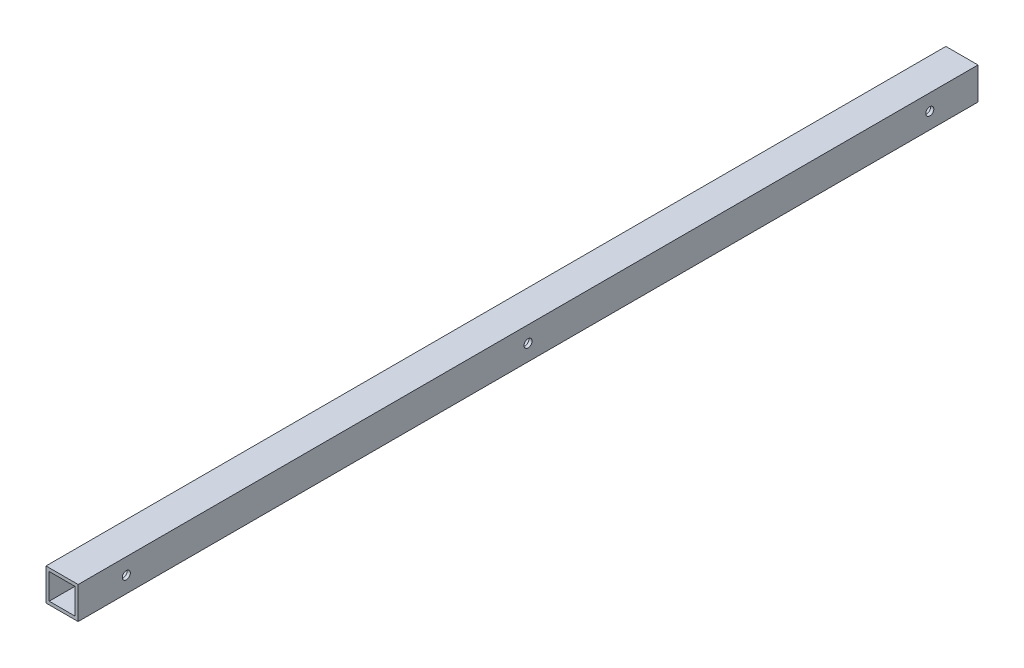
ISO-10303-21;
HEADER;
FILE_DESCRIPTION(('STEP AP214'),'2;1');
FILE_NAME('part.step','',(''),(''),'','','');
FILE_SCHEMA(('AUTOMOTIVE_DESIGN { 1 0 10303 214 1 1 1 1 }'));
ENDSEC;
DATA;
#1=APPLICATION_CONTEXT('core data for automotive mechanical design processes');
#2=APPLICATION_PROTOCOL_DEFINITION('international standard','automotive_design',2000,#1);
#3=PRODUCT_CONTEXT('',#1,'mechanical');
#4=PRODUCT('Part','Part','',(#3));
#5=PRODUCT_RELATED_PRODUCT_CATEGORY('part','',(#4));
#6=PRODUCT_DEFINITION_FORMATION('','',#4);
#7=PRODUCT_DEFINITION_CONTEXT('part definition',#1,'design');
#8=PRODUCT_DEFINITION('design','',#6,#7);
#9=PRODUCT_DEFINITION_SHAPE('','',#8);
#10=(LENGTH_UNIT() NAMED_UNIT(*) SI_UNIT(.MILLI.,.METRE.));
#11=(NAMED_UNIT(*) PLANE_ANGLE_UNIT() SI_UNIT($,.RADIAN.));
#12=(NAMED_UNIT(*) SI_UNIT($,.STERADIAN.) SOLID_ANGLE_UNIT());
#13=UNCERTAINTY_MEASURE_WITH_UNIT(LENGTH_MEASURE(1.E-05),#10,'distance_accuracy_value','');
#14=(GEOMETRIC_REPRESENTATION_CONTEXT(3) GLOBAL_UNCERTAINTY_ASSIGNED_CONTEXT((#13)) GLOBAL_UNIT_ASSIGNED_CONTEXT((#10,
#11,#12)) REPRESENTATION_CONTEXT('',''));
#15=CARTESIAN_POINT('',(0.,0.,0.));
#16=DIRECTION('',(0.,0.,1.));
#17=DIRECTION('',(1.,0.,0.));
#18=AXIS2_PLACEMENT_3D('',#15,#16,#17);
#19=CARTESIAN_POINT('',(10.,10.,-560.));
#20=DIRECTION('',(1.,0.,0.));
#21=DIRECTION('',(0.,0.,-1.));
#22=AXIS2_PLACEMENT_3D('',#19,#20,#21);
#23=PLANE('',#22);
#24=CARTESIAN_POINT('',(10.,0.,-530.));
#25=DIRECTION('',(1.,0.,0.));
#26=DIRECTION('',(0.,0.,-1.));
#27=AXIS2_PLACEMENT_3D('',#24,#25,#26);
#28=CIRCLE('',#27,2.50000000000003);
#29=CARTESIAN_POINT('',(10.,0.,-532.5));
#30=VERTEX_POINT('',#29);
#31=EDGE_CURVE('E223',#30,#30,#28,.T.);
#32=ORIENTED_EDGE('',*,*,#31,.F.);
#33=EDGE_LOOP('',(#32));
#34=FACE_BOUND('',#33,.T.);
#35=CARTESIAN_POINT('',(10.,0.,-30.));
#36=DIRECTION('',(1.,0.,0.));
#37=DIRECTION('',(0.,0.,-1.));
#38=AXIS2_PLACEMENT_3D('',#35,#36,#37);
#39=CIRCLE('',#38,2.49999999999999);
#40=CARTESIAN_POINT('',(10.,0.,-32.5));
#41=VERTEX_POINT('',#40);
#42=EDGE_CURVE('E231',#41,#41,#39,.T.);
#43=ORIENTED_EDGE('',*,*,#42,.F.);
#44=EDGE_LOOP('',(#43));
#45=FACE_BOUND('',#44,.T.);
#46=CARTESIAN_POINT('',(10.,0.,-280.));
#47=DIRECTION('',(1.,0.,0.));
#48=DIRECTION('',(0.,0.,-1.));
#49=AXIS2_PLACEMENT_3D('',#46,#47,#48);
#50=CIRCLE('',#49,2.50000000000002);
#51=CARTESIAN_POINT('',(10.,0.,-282.5));
#52=VERTEX_POINT('',#51);
#53=EDGE_CURVE('E215',#52,#52,#50,.T.);
#54=ORIENTED_EDGE('',*,*,#53,.F.);
#55=EDGE_LOOP('',(#54));
#56=FACE_BOUND('',#55,.T.);
#57=DIRECTION('',(0.,1.,0.));
#58=VECTOR('',#57,1.);
#59=CARTESIAN_POINT('',(10.,10.,0.));
#60=LINE('',#59,#58);
#61=CARTESIAN_POINT('',(10.,-10.,0.));
#62=VERTEX_POINT('',#61);
#63=CARTESIAN_POINT('',(10.,10.,0.));
#64=VERTEX_POINT('',#63);
#65=EDGE_CURVE('E151',#62,#64,#60,.T.);
#66=ORIENTED_EDGE('',*,*,#65,.F.);
#67=DIRECTION('',(0.,0.,1.));
#68=VECTOR('',#67,1.);
#69=CARTESIAN_POINT('',(10.,-10.,-560.));
#70=LINE('',#69,#68);
#71=CARTESIAN_POINT('',(10.,-10.,-560.));
#72=VERTEX_POINT('',#71);
#73=EDGE_CURVE('E11',#72,#62,#70,.T.);
#74=ORIENTED_EDGE('',*,*,#73,.F.);
#75=DIRECTION('',(0.,1.,0.));
#76=VECTOR('',#75,1.);
#77=CARTESIAN_POINT('',(10.,10.,-560.));
#78=LINE('',#77,#76);
#79=CARTESIAN_POINT('',(10.,10.,-560.));
#80=VERTEX_POINT('',#79);
#81=EDGE_CURVE('E157',#72,#80,#78,.T.);
#82=ORIENTED_EDGE('',*,*,#81,.T.);
#83=DIRECTION('',(0.,0.,1.));
#84=VECTOR('',#83,1.);
#85=CARTESIAN_POINT('',(10.,10.,-560.));
#86=LINE('',#85,#84);
#87=EDGE_CURVE('E174',#80,#64,#86,.T.);
#88=ORIENTED_EDGE('',*,*,#87,.T.);
#89=EDGE_LOOP('',(#66,#74,#82,#88));
#90=FACE_BOUND('',#89,.T.);
#91=ADVANCED_FACE('F39',(#34,#45,#56,#90),#23,.T.);
#92=CARTESIAN_POINT('',(-10.,-10.,-560.));
#93=DIRECTION('',(0.,-1.,0.));
#94=DIRECTION('',(0.,0.,-1.));
#95=AXIS2_PLACEMENT_3D('',#92,#93,#94);
#96=PLANE('',#95);
#97=DIRECTION('',(1.,0.,0.));
#98=VECTOR('',#97,1.);
#99=CARTESIAN_POINT('',(-10.,-10.,0.));
#100=LINE('',#99,#98);
#101=CARTESIAN_POINT('',(-10.,-10.,0.));
#102=VERTEX_POINT('',#101);
#103=EDGE_CURVE('E162',#102,#62,#100,.T.);
#104=ORIENTED_EDGE('',*,*,#103,.F.);
#105=DIRECTION('',(0.,0.,1.));
#106=VECTOR('',#105,1.);
#107=CARTESIAN_POINT('',(-10.,-10.,-560.));
#108=LINE('',#107,#106);
#109=CARTESIAN_POINT('',(-10.,-10.,-560.));
#110=VERTEX_POINT('',#109);
#111=EDGE_CURVE('E48',#110,#102,#108,.T.);
#112=ORIENTED_EDGE('',*,*,#111,.F.);
#113=DIRECTION('',(1.,0.,0.));
#114=VECTOR('',#113,1.);
#115=CARTESIAN_POINT('',(-10.,-10.,-560.));
#116=LINE('',#115,#114);
#117=EDGE_CURVE('E170',#110,#72,#116,.T.);
#118=ORIENTED_EDGE('',*,*,#117,.T.);
#119=ORIENTED_EDGE('',*,*,#73,.T.);
#120=EDGE_LOOP('',(#104,#112,#118,#119));
#121=FACE_BOUND('',#120,.T.);
#122=ADVANCED_FACE('F262',(#121),#96,.T.);
#123=CARTESIAN_POINT('',(-10.,10.,-560.));
#124=DIRECTION('',(-1.,0.,0.));
#125=DIRECTION('',(0.,-1.,0.));
#126=AXIS2_PLACEMENT_3D('',#123,#124,#125);
#127=PLANE('',#126);
#128=CARTESIAN_POINT('',(-10.,0.,-530.));
#129=DIRECTION('',(1.,0.,0.));
#130=DIRECTION('',(0.,0.,-1.));
#131=AXIS2_PLACEMENT_3D('',#128,#129,#130);
#132=CIRCLE('',#131,2.50000000000003);
#133=CARTESIAN_POINT('',(-10.,0.,-532.5));
#134=VERTEX_POINT('',#133);
#135=EDGE_CURVE('E227',#134,#134,#132,.T.);
#136=ORIENTED_EDGE('',*,*,#135,.T.);
#137=EDGE_LOOP('',(#136));
#138=FACE_BOUND('',#137,.T.);
#139=CARTESIAN_POINT('',(-10.,0.,-30.));
#140=DIRECTION('',(1.,0.,0.));
#141=DIRECTION('',(0.,0.,-1.));
#142=AXIS2_PLACEMENT_3D('',#139,#140,#141);
#143=CIRCLE('',#142,2.49999999999999);
#144=CARTESIAN_POINT('',(-10.,0.,-32.5));
#145=VERTEX_POINT('',#144);
#146=EDGE_CURVE('E219',#145,#145,#143,.T.);
#147=ORIENTED_EDGE('',*,*,#146,.T.);
#148=EDGE_LOOP('',(#147));
#149=FACE_BOUND('',#148,.T.);
#150=CARTESIAN_POINT('',(-10.,0.,-280.));
#151=DIRECTION('',(1.,0.,0.));
#152=DIRECTION('',(0.,0.,-1.));
#153=AXIS2_PLACEMENT_3D('',#150,#151,#152);
#154=CIRCLE('',#153,2.50000000000002);
#155=CARTESIAN_POINT('',(-10.,0.,-282.5));
#156=VERTEX_POINT('',#155);
#157=EDGE_CURVE('E200',#156,#156,#154,.T.);
#158=ORIENTED_EDGE('',*,*,#157,.T.);
#159=EDGE_LOOP('',(#158));
#160=FACE_BOUND('',#159,.T.);
#161=DIRECTION('',(0.,-1.,0.));
#162=VECTOR('',#161,1.);
#163=CARTESIAN_POINT('',(-10.,10.,0.));
#164=LINE('',#163,#162);
#165=CARTESIAN_POINT('',(-10.,10.,0.));
#166=VERTEX_POINT('',#165);
#167=EDGE_CURVE('E182',#166,#102,#164,.T.);
#168=ORIENTED_EDGE('',*,*,#167,.F.);
#169=DIRECTION('',(0.,0.,1.));
#170=VECTOR('',#169,1.);
#171=CARTESIAN_POINT('',(-10.,10.,-560.));
#172=LINE('',#171,#170);
#173=CARTESIAN_POINT('',(-10.,10.,-560.));
#174=VERTEX_POINT('',#173);
#175=EDGE_CURVE('E191',#174,#166,#172,.T.);
#176=ORIENTED_EDGE('',*,*,#175,.F.);
#177=DIRECTION('',(0.,-1.,0.));
#178=VECTOR('',#177,1.);
#179=CARTESIAN_POINT('',(-10.,10.,-560.));
#180=LINE('',#179,#178);
#181=EDGE_CURVE('E166',#174,#110,#180,.T.);
#182=ORIENTED_EDGE('',*,*,#181,.T.);
#183=ORIENTED_EDGE('',*,*,#111,.T.);
#184=EDGE_LOOP('',(#168,#176,#182,#183));
#185=FACE_BOUND('',#184,.T.);
#186=ADVANCED_FACE('F239',(#138,#149,#160,#185),#127,.T.);
#187=CARTESIAN_POINT('',(-10.,10.,-560.));
#188=DIRECTION('',(0.,1.,0.));
#189=DIRECTION('',(0.,0.,1.));
#190=AXIS2_PLACEMENT_3D('',#187,#188,#189);
#191=PLANE('',#190);
#192=DIRECTION('',(-1.,0.,0.));
#193=VECTOR('',#192,1.);
#194=CARTESIAN_POINT('',(-10.,10.,0.));
#195=LINE('',#194,#193);
#196=EDGE_CURVE('E178',#64,#166,#195,.T.);
#197=ORIENTED_EDGE('',*,*,#196,.F.);
#198=ORIENTED_EDGE('',*,*,#87,.F.);
#199=DIRECTION('',(-1.,0.,0.));
#200=VECTOR('',#199,1.);
#201=CARTESIAN_POINT('',(-10.,10.,-560.));
#202=LINE('',#201,#200);
#203=EDGE_CURVE('E161',#80,#174,#202,.T.);
#204=ORIENTED_EDGE('',*,*,#203,.T.);
#205=ORIENTED_EDGE('',*,*,#175,.T.);
#206=EDGE_LOOP('',(#197,#198,#204,#205));
#207=FACE_BOUND('',#206,.T.);
#208=ADVANCED_FACE('F286',(#207),#191,.T.);
#209=CARTESIAN_POINT('',(0.,0.,-560.));
#210=DIRECTION('',(0.,0.,1.));
#211=DIRECTION('',(1.,0.,0.));
#212=AXIS2_PLACEMENT_3D('',#209,#210,#211);
#213=PLANE('',#212);
#214=DIRECTION('',(1.,0.,0.));
#215=VECTOR('',#214,1.);
#216=CARTESIAN_POINT('',(-8.,-8.,-560.));
#217=LINE('',#216,#215);
#218=CARTESIAN_POINT('',(-8.,-8.,-560.));
#219=VERTEX_POINT('',#218);
#220=CARTESIAN_POINT('',(8.,-8.,-560.));
#221=VERTEX_POINT('',#220);
#222=EDGE_CURVE('E114',#219,#221,#217,.T.);
#223=ORIENTED_EDGE('',*,*,#222,.T.);
#224=DIRECTION('',(0.,1.,0.));
#225=VECTOR('',#224,1.);
#226=CARTESIAN_POINT('',(8.,8.,-560.));
#227=LINE('',#226,#225);
#228=CARTESIAN_POINT('',(8.,8.,-560.));
#229=VERTEX_POINT('',#228);
#230=EDGE_CURVE('E107',#221,#229,#227,.T.);
#231=ORIENTED_EDGE('',*,*,#230,.T.);
#232=DIRECTION('',(-1.,0.,0.));
#233=VECTOR('',#232,1.);
#234=CARTESIAN_POINT('',(-8.,8.,-560.));
#235=LINE('',#234,#233);
#236=CARTESIAN_POINT('',(-8.,8.,-560.));
#237=VERTEX_POINT('',#236);
#238=EDGE_CURVE('E117',#229,#237,#235,.T.);
#239=ORIENTED_EDGE('',*,*,#238,.T.);
#240=DIRECTION('',(0.,-1.,0.));
#241=VECTOR('',#240,1.);
#242=CARTESIAN_POINT('',(-8.,8.,-560.));
#243=LINE('',#242,#241);
#244=EDGE_CURVE('E56',#237,#219,#243,.T.);
#245=ORIENTED_EDGE('',*,*,#244,.T.);
#246=EDGE_LOOP('',(#223,#231,#239,#245));
#247=FACE_BOUND('',#246,.T.);
#248=ORIENTED_EDGE('',*,*,#81,.F.);
#249=ORIENTED_EDGE('',*,*,#117,.F.);
#250=ORIENTED_EDGE('',*,*,#181,.F.);
#251=ORIENTED_EDGE('',*,*,#203,.F.);
#252=EDGE_LOOP('',(#248,#249,#250,#251));
#253=FACE_BOUND('',#252,.T.);
#254=ADVANCED_FACE('F122',(#247,#253),#213,.F.);
#255=CARTESIAN_POINT('',(0.,0.,0.));
#256=DIRECTION('',(0.,0.,1.));
#257=DIRECTION('',(1.,0.,0.));
#258=AXIS2_PLACEMENT_3D('',#255,#256,#257);
#259=PLANE('',#258);
#260=DIRECTION('',(0.,1.,0.));
#261=VECTOR('',#260,1.);
#262=CARTESIAN_POINT('',(8.,8.,0.));
#263=LINE('',#262,#261);
#264=CARTESIAN_POINT('',(8.,-8.,0.));
#265=VERTEX_POINT('',#264);
#266=CARTESIAN_POINT('',(8.,8.,0.));
#267=VERTEX_POINT('',#266);
#268=EDGE_CURVE('E64',#265,#267,#263,.T.);
#269=ORIENTED_EDGE('',*,*,#268,.F.);
#270=DIRECTION('',(1.,0.,0.));
#271=VECTOR('',#270,1.);
#272=CARTESIAN_POINT('',(-8.,-8.,0.));
#273=LINE('',#272,#271);
#274=CARTESIAN_POINT('',(-8.,-8.,0.));
#275=VERTEX_POINT('',#274);
#276=EDGE_CURVE('E126',#275,#265,#273,.T.);
#277=ORIENTED_EDGE('',*,*,#276,.F.);
#278=DIRECTION('',(0.,-1.,0.));
#279=VECTOR('',#278,1.);
#280=CARTESIAN_POINT('',(-8.,8.,0.));
#281=LINE('',#280,#279);
#282=CARTESIAN_POINT('',(-8.,8.,0.));
#283=VERTEX_POINT('',#282);
#284=EDGE_CURVE('E130',#283,#275,#281,.T.);
#285=ORIENTED_EDGE('',*,*,#284,.F.);
#286=DIRECTION('',(-1.,0.,0.));
#287=VECTOR('',#286,1.);
#288=CARTESIAN_POINT('',(-8.,8.,0.));
#289=LINE('',#288,#287);
#290=EDGE_CURVE('E142',#267,#283,#289,.T.);
#291=ORIENTED_EDGE('',*,*,#290,.F.);
#292=EDGE_LOOP('',(#269,#277,#285,#291));
#293=FACE_BOUND('',#292,.T.);
#294=ORIENTED_EDGE('',*,*,#65,.T.);
#295=ORIENTED_EDGE('',*,*,#196,.T.);
#296=ORIENTED_EDGE('',*,*,#167,.T.);
#297=ORIENTED_EDGE('',*,*,#103,.T.);
#298=EDGE_LOOP('',(#294,#295,#296,#297));
#299=FACE_BOUND('',#298,.T.);
#300=ADVANCED_FACE('F280',(#293,#299),#259,.T.);
#301=CARTESIAN_POINT('',(8.,8.,-560.));
#302=DIRECTION('',(1.,0.,0.));
#303=DIRECTION('',(0.,1.,0.));
#304=AXIS2_PLACEMENT_3D('',#301,#302,#303);
#305=PLANE('',#304);
#306=CARTESIAN_POINT('',(8.,0.,-530.));
#307=DIRECTION('',(1.,0.,0.));
#308=DIRECTION('',(0.,1.,0.));
#309=AXIS2_PLACEMENT_3D('',#306,#307,#308);
#310=CIRCLE('',#309,2.50000000000003);
#311=CARTESIAN_POINT('',(8.,2.50000000000003,-530.));
#312=VERTEX_POINT('',#311);
#313=EDGE_CURVE('E133',#312,#312,#310,.T.);
#314=ORIENTED_EDGE('',*,*,#313,.T.);
#315=EDGE_LOOP('',(#314));
#316=FACE_BOUND('',#315,.T.);
#317=CARTESIAN_POINT('',(8.,0.,-30.));
#318=DIRECTION('',(1.,0.,0.));
#319=DIRECTION('',(0.,1.,0.));
#320=AXIS2_PLACEMENT_3D('',#317,#318,#319);
#321=CIRCLE('',#320,2.49999999999999);
#322=CARTESIAN_POINT('',(8.,2.49999999999999,-30.));
#323=VERTEX_POINT('',#322);
#324=EDGE_CURVE('E204',#323,#323,#321,.T.);
#325=ORIENTED_EDGE('',*,*,#324,.T.);
#326=EDGE_LOOP('',(#325));
#327=FACE_BOUND('',#326,.T.);
#328=CARTESIAN_POINT('',(8.,0.,-280.));
#329=DIRECTION('',(1.,0.,0.));
#330=DIRECTION('',(0.,1.,0.));
#331=AXIS2_PLACEMENT_3D('',#328,#329,#330);
#332=CIRCLE('',#331,2.50000000000002);
#333=CARTESIAN_POINT('',(8.,2.50000000000002,-280.));
#334=VERTEX_POINT('',#333);
#335=EDGE_CURVE('E199',#334,#334,#332,.T.);
#336=ORIENTED_EDGE('',*,*,#335,.T.);
#337=EDGE_LOOP('',(#336));
#338=FACE_BOUND('',#337,.T.);
#339=ORIENTED_EDGE('',*,*,#268,.T.);
#340=DIRECTION('',(0.,0.,1.));
#341=VECTOR('',#340,1.);
#342=CARTESIAN_POINT('',(8.,8.,-560.));
#343=LINE('',#342,#341);
#344=EDGE_CURVE('E103',#229,#267,#343,.T.);
#345=ORIENTED_EDGE('',*,*,#344,.F.);
#346=ORIENTED_EDGE('',*,*,#230,.F.);
#347=DIRECTION('',(0.,0.,1.));
#348=VECTOR('',#347,1.);
#349=CARTESIAN_POINT('',(8.,-8.,-560.));
#350=LINE('',#349,#348);
#351=EDGE_CURVE('E148',#221,#265,#350,.T.);
#352=ORIENTED_EDGE('',*,*,#351,.T.);
#353=EDGE_LOOP('',(#339,#345,#346,#352));
#354=FACE_BOUND('',#353,.T.);
#355=ADVANCED_FACE('F105',(#316,#327,#338,#354),#305,.F.);
#356=CARTESIAN_POINT('',(-8.,-8.,-560.));
#357=DIRECTION('',(0.,-1.,0.));
#358=DIRECTION('',(0.,0.,-1.));
#359=AXIS2_PLACEMENT_3D('',#356,#357,#358);
#360=PLANE('',#359);
#361=ORIENTED_EDGE('',*,*,#276,.T.);
#362=ORIENTED_EDGE('',*,*,#351,.F.);
#363=ORIENTED_EDGE('',*,*,#222,.F.);
#364=DIRECTION('',(0.,0.,1.));
#365=VECTOR('',#364,1.);
#366=CARTESIAN_POINT('',(-8.,-8.,-560.));
#367=LINE('',#366,#365);
#368=EDGE_CURVE('E152',#219,#275,#367,.T.);
#369=ORIENTED_EDGE('',*,*,#368,.T.);
#370=EDGE_LOOP('',(#361,#362,#363,#369));
#371=FACE_BOUND('',#370,.T.);
#372=ADVANCED_FACE('F302',(#371),#360,.F.);
#373=CARTESIAN_POINT('',(-8.,8.,-560.));
#374=DIRECTION('',(-1.,0.,0.));
#375=DIRECTION('',(0.,-1.,0.));
#376=AXIS2_PLACEMENT_3D('',#373,#374,#375);
#377=PLANE('',#376);
#378=CARTESIAN_POINT('',(-8.,0.,-530.));
#379=DIRECTION('',(-1.,0.,0.));
#380=DIRECTION('',(0.,-1.,0.));
#381=AXIS2_PLACEMENT_3D('',#378,#379,#380);
#382=CIRCLE('',#381,2.50000000000003);
#383=CARTESIAN_POINT('',(-8.,-2.50000000000003,-530.));
#384=VERTEX_POINT('',#383);
#385=EDGE_CURVE('E42',#384,#384,#382,.T.);
#386=ORIENTED_EDGE('',*,*,#385,.T.);
#387=EDGE_LOOP('',(#386));
#388=FACE_BOUND('',#387,.T.);
#389=CARTESIAN_POINT('',(-8.,0.,-30.));
#390=DIRECTION('',(-1.,0.,0.));
#391=DIRECTION('',(0.,-1.,0.));
#392=AXIS2_PLACEMENT_3D('',#389,#390,#391);
#393=CIRCLE('',#392,2.49999999999999);
#394=CARTESIAN_POINT('',(-8.,-2.49999999999999,-30.));
#395=VERTEX_POINT('',#394);
#396=EDGE_CURVE('E201',#395,#395,#393,.T.);
#397=ORIENTED_EDGE('',*,*,#396,.T.);
#398=EDGE_LOOP('',(#397));
#399=FACE_BOUND('',#398,.T.);
#400=CARTESIAN_POINT('',(-8.,0.,-280.));
#401=DIRECTION('',(-1.,0.,0.));
#402=DIRECTION('',(0.,-1.,0.));
#403=AXIS2_PLACEMENT_3D('',#400,#401,#402);
#404=CIRCLE('',#403,2.50000000000002);
#405=CARTESIAN_POINT('',(-8.,-2.50000000000002,-280.));
#406=VERTEX_POINT('',#405);
#407=EDGE_CURVE('E196',#406,#406,#404,.T.);
#408=ORIENTED_EDGE('',*,*,#407,.T.);
#409=EDGE_LOOP('',(#408));
#410=FACE_BOUND('',#409,.T.);
#411=ORIENTED_EDGE('',*,*,#284,.T.);
#412=ORIENTED_EDGE('',*,*,#368,.F.);
#413=ORIENTED_EDGE('',*,*,#244,.F.);
#414=DIRECTION('',(0.,0.,1.));
#415=VECTOR('',#414,1.);
#416=CARTESIAN_POINT('',(-8.,8.,-560.));
#417=LINE('',#416,#415);
#418=EDGE_CURVE('E113',#237,#283,#417,.T.);
#419=ORIENTED_EDGE('',*,*,#418,.T.);
#420=EDGE_LOOP('',(#411,#412,#413,#419));
#421=FACE_BOUND('',#420,.T.);
#422=ADVANCED_FACE('F306',(#388,#399,#410,#421),#377,.F.);
#423=CARTESIAN_POINT('',(-8.,8.,-560.));
#424=DIRECTION('',(0.,1.,0.));
#425=DIRECTION('',(0.,0.,1.));
#426=AXIS2_PLACEMENT_3D('',#423,#424,#425);
#427=PLANE('',#426);
#428=ORIENTED_EDGE('',*,*,#290,.T.);
#429=ORIENTED_EDGE('',*,*,#418,.F.);
#430=ORIENTED_EDGE('',*,*,#238,.F.);
#431=ORIENTED_EDGE('',*,*,#344,.T.);
#432=EDGE_LOOP('',(#428,#429,#430,#431));
#433=FACE_BOUND('',#432,.T.);
#434=ADVANCED_FACE('F118',(#433),#427,.F.);
#435=CARTESIAN_POINT('',(-10.,0.,-280.));
#436=DIRECTION('',(1.,0.,0.));
#437=DIRECTION('',(0.,0.,-1.));
#438=AXIS2_PLACEMENT_3D('',#435,#436,#437);
#439=CYLINDRICAL_SURFACE('',#438,2.50000000000002);
#440=ORIENTED_EDGE('',*,*,#157,.F.);
#441=EDGE_LOOP('',(#440));
#442=FACE_BOUND('',#441,.T.);
#443=ORIENTED_EDGE('',*,*,#407,.F.);
#444=EDGE_LOOP('',(#443));
#445=FACE_BOUND('',#444,.T.);
#446=ADVANCED_FACE('F246',(#442,#445),#439,.F.);
#447=CARTESIAN_POINT('',(-10.,0.,-30.));
#448=DIRECTION('',(1.,0.,0.));
#449=DIRECTION('',(0.,0.,-1.));
#450=AXIS2_PLACEMENT_3D('',#447,#448,#449);
#451=CYLINDRICAL_SURFACE('',#450,2.49999999999999);
#452=ORIENTED_EDGE('',*,*,#146,.F.);
#453=EDGE_LOOP('',(#452));
#454=FACE_BOUND('',#453,.T.);
#455=ORIENTED_EDGE('',*,*,#396,.F.);
#456=EDGE_LOOP('',(#455));
#457=FACE_BOUND('',#456,.T.);
#458=ADVANCED_FACE('F242',(#454,#457),#451,.F.);
#459=CARTESIAN_POINT('',(-10.,0.,-530.));
#460=DIRECTION('',(1.,0.,0.));
#461=DIRECTION('',(0.,0.,-1.));
#462=AXIS2_PLACEMENT_3D('',#459,#460,#461);
#463=CYLINDRICAL_SURFACE('',#462,2.50000000000003);
#464=ORIENTED_EDGE('',*,*,#135,.F.);
#465=EDGE_LOOP('',(#464));
#466=FACE_BOUND('',#465,.T.);
#467=ORIENTED_EDGE('',*,*,#385,.F.);
#468=EDGE_LOOP('',(#467));
#469=FACE_BOUND('',#468,.T.);
#470=ADVANCED_FACE('F245',(#466,#469),#463,.F.);
#471=ORIENTED_EDGE('',*,*,#53,.T.);
#472=EDGE_LOOP('',(#471));
#473=FACE_BOUND('',#472,.T.);
#474=ORIENTED_EDGE('',*,*,#335,.F.);
#475=EDGE_LOOP('',(#474));
#476=FACE_BOUND('',#475,.T.);
#477=ADVANCED_FACE('F253',(#473,#476),#439,.F.);
#478=ORIENTED_EDGE('',*,*,#42,.T.);
#479=EDGE_LOOP('',(#478));
#480=FACE_BOUND('',#479,.T.);
#481=ORIENTED_EDGE('',*,*,#324,.F.);
#482=EDGE_LOOP('',(#481));
#483=FACE_BOUND('',#482,.T.);
#484=ADVANCED_FACE('F248',(#480,#483),#451,.F.);
#485=ORIENTED_EDGE('',*,*,#31,.T.);
#486=EDGE_LOOP('',(#485));
#487=FACE_BOUND('',#486,.T.);
#488=ORIENTED_EDGE('',*,*,#313,.F.);
#489=EDGE_LOOP('',(#488));
#490=FACE_BOUND('',#489,.T.);
#491=ADVANCED_FACE('F256',(#487,#490),#463,.F.);
#492=CLOSED_SHELL('',(#91,#122,#186,#208,#254,#300,#355,#372,#422,#434,#446,#458,#470,#477,#484,#491));
#493=MANIFOLD_SOLID_BREP('B2',#492);
#494=ADVANCED_BREP_SHAPE_REPRESENTATION('',(#18,#493),#14);
#495=SHAPE_DEFINITION_REPRESENTATION(#9,#494);
ENDSEC;
END-ISO-10303-21;
